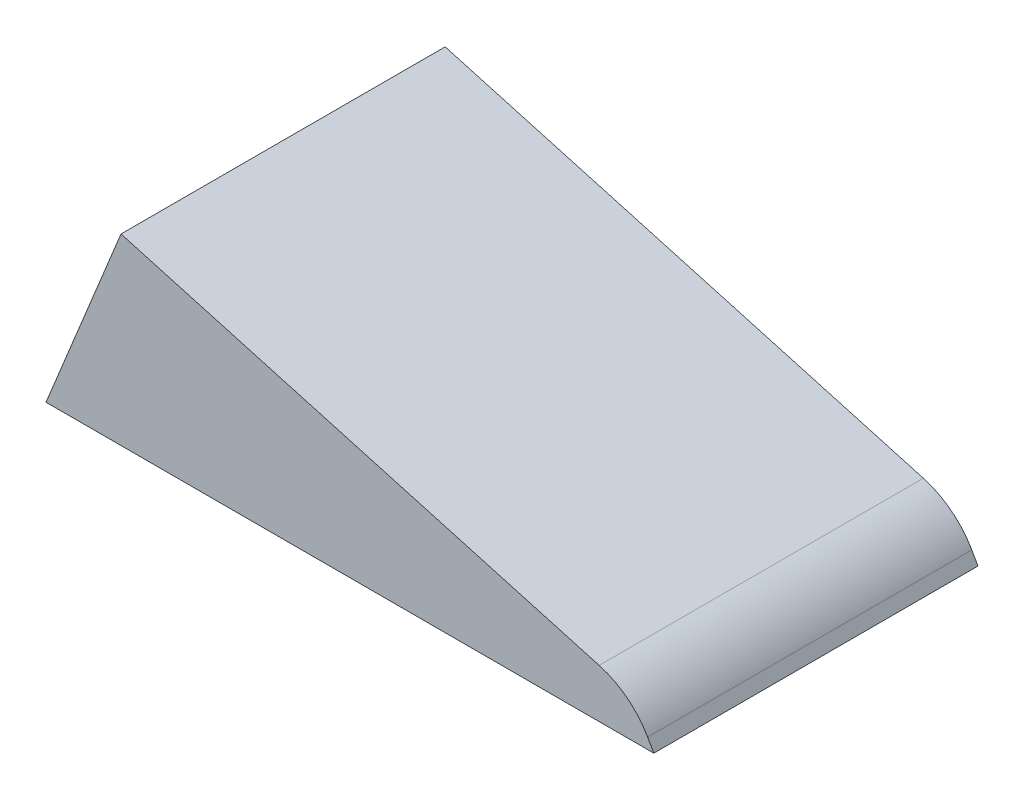
ISO-10303-21;
HEADER;
FILE_DESCRIPTION(('STEP AP214'),'2;1');
FILE_NAME('part.step','',(''),(''),'','','');
FILE_SCHEMA(('AUTOMOTIVE_DESIGN { 1 0 10303 214 1 1 1 1 }'));
ENDSEC;
DATA;
#1=APPLICATION_CONTEXT('core data for automotive mechanical design processes');
#2=APPLICATION_PROTOCOL_DEFINITION('international standard','automotive_design',2000,#1);
#3=PRODUCT_CONTEXT('',#1,'mechanical');
#4=PRODUCT('Part','Part','',(#3));
#5=PRODUCT_RELATED_PRODUCT_CATEGORY('part','',(#4));
#6=PRODUCT_DEFINITION_FORMATION('','',#4);
#7=PRODUCT_DEFINITION_CONTEXT('part definition',#1,'design');
#8=PRODUCT_DEFINITION('design','',#6,#7);
#9=PRODUCT_DEFINITION_SHAPE('','',#8);
#10=(LENGTH_UNIT() NAMED_UNIT(*) SI_UNIT(.MILLI.,.METRE.));
#11=(NAMED_UNIT(*) PLANE_ANGLE_UNIT() SI_UNIT($,.RADIAN.));
#12=(NAMED_UNIT(*) SI_UNIT($,.STERADIAN.) SOLID_ANGLE_UNIT());
#13=UNCERTAINTY_MEASURE_WITH_UNIT(LENGTH_MEASURE(1.E-05),#10,'distance_accuracy_value','');
#14=(GEOMETRIC_REPRESENTATION_CONTEXT(3) GLOBAL_UNCERTAINTY_ASSIGNED_CONTEXT((#13)) GLOBAL_UNIT_ASSIGNED_CONTEXT((#10,
#11,#12)) REPRESENTATION_CONTEXT('',''));
#15=CARTESIAN_POINT('',(0.,0.,0.));
#16=DIRECTION('',(0.,0.,1.));
#17=DIRECTION('',(1.,0.,0.));
#18=AXIS2_PLACEMENT_3D('',#15,#16,#17);
#19=CARTESIAN_POINT('',(293.18251347766,-54.6718210159724,203.2));
#20=DIRECTION('',(0.,1.,0.));
#21=DIRECTION('',(-1.,0.,0.));
#22=AXIS2_PLACEMENT_3D('',#19,#20,#21);
#23=PLANE('',#22);
#24=DIRECTION('',(1.,0.,0.));
#25=VECTOR('',#24,1.);
#26=CARTESIAN_POINT('',(293.18251347766,-54.6718210159724,0.));
#27=LINE('',#26,#25);
#28=CARTESIAN_POINT('',(-87.81748652234,-54.6718210159725,0.));
#29=VERTEX_POINT('',#28);
#30=CARTESIAN_POINT('',(293.18251347766,-54.6718210159724,0.));
#31=VERTEX_POINT('',#30);
#32=EDGE_CURVE('E97',#29,#31,#27,.T.);
#33=ORIENTED_EDGE('',*,*,#32,.T.);
#34=DIRECTION('',(0.,0.,-1.));
#35=VECTOR('',#34,1.);
#36=CARTESIAN_POINT('',(293.18251347766,-54.6718210159724,203.2));
#37=LINE('',#36,#35);
#38=CARTESIAN_POINT('',(293.18251347766,-54.6718210159724,203.2));
#39=VERTEX_POINT('',#38);
#40=EDGE_CURVE('E80',#39,#31,#37,.T.);
#41=ORIENTED_EDGE('',*,*,#40,.F.);
#42=DIRECTION('',(1.,0.,0.));
#43=VECTOR('',#42,1.);
#44=CARTESIAN_POINT('',(293.18251347766,-54.6718210159724,203.2));
#45=LINE('',#44,#43);
#46=CARTESIAN_POINT('',(-87.81748652234,-54.6718210159725,203.2));
#47=VERTEX_POINT('',#46);
#48=EDGE_CURVE('E85',#47,#39,#45,.T.);
#49=ORIENTED_EDGE('',*,*,#48,.F.);
#50=DIRECTION('',(0.,0.,-1.));
#51=VECTOR('',#50,1.);
#52=CARTESIAN_POINT('',(-87.81748652234,-54.6718210159725,203.2));
#53=LINE('',#52,#51);
#54=EDGE_CURVE('E104',#47,#29,#53,.T.);
#55=ORIENTED_EDGE('',*,*,#54,.T.);
#56=EDGE_LOOP('',(#33,#41,#49,#55));
#57=FACE_BOUND('',#56,.T.);
#58=ADVANCED_FACE('F33',(#57),#23,.F.);
#59=CARTESIAN_POINT('',(278.977822444077,-29.7727212354211,203.2));
#60=DIRECTION('',(-0.868594049851145,-0.49552434507619,0.));
#61=DIRECTION('',(0.49552434507619,-0.868594049851145,0.));
#62=AXIS2_PLACEMENT_3D('',#59,#60,#61);
#63=PLANE('',#62);
#64=DIRECTION('',(-0.49552434507619,0.868594049851145,0.));
#65=VECTOR('',#64,1.);
#66=CARTESIAN_POINT('',(278.977822444077,-29.7727212354211,0.));
#67=LINE('',#66,#65);
#68=CARTESIAN_POINT('',(289.298029598701,-47.8627921205553,0.));
#69=VERTEX_POINT('',#68);
#70=EDGE_CURVE('E112',#31,#69,#67,.T.);
#71=ORIENTED_EDGE('',*,*,#70,.T.);
#72=DIRECTION('',(0.,0.,-1.));
#73=VECTOR('',#72,1.);
#74=CARTESIAN_POINT('',(289.298029598701,-47.8627921205553,203.2));
#75=LINE('',#74,#73);
#76=CARTESIAN_POINT('',(289.298029598701,-47.8627921205553,203.2));
#77=VERTEX_POINT('',#76);
#78=EDGE_CURVE('E41',#69,#77,#75,.F.);
#79=ORIENTED_EDGE('',*,*,#78,.T.);
#80=DIRECTION('',(-0.49552434507619,0.868594049851145,0.));
#81=VECTOR('',#80,1.);
#82=CARTESIAN_POINT('',(278.977822444077,-29.7727212354211,203.2));
#83=LINE('',#82,#81);
#84=EDGE_CURVE('E76',#39,#77,#83,.T.);
#85=ORIENTED_EDGE('',*,*,#84,.F.);
#86=ORIENTED_EDGE('',*,*,#40,.T.);
#87=EDGE_LOOP('',(#71,#79,#85,#86));
#88=FACE_BOUND('',#87,.T.);
#89=ADVANCED_FACE('F78',(#88),#63,.F.);
#90=CARTESIAN_POINT('',(-40.8116602225022,60.1801663624286,203.2));
#91=DIRECTION('',(-0.270779318330784,-0.962641449743525,0.));
#92=DIRECTION('',(0.962641449743525,-0.270779318330784,0.));
#93=AXIS2_PLACEMENT_3D('',#90,#91,#92);
#94=PLANE('',#93);
#95=DIRECTION('',(-0.962641449743525,0.270779318330784,0.));
#96=VECTOR('',#95,1.);
#97=CARTESIAN_POINT('',(-40.8116602225022,60.1801663624286,203.2));
#98=LINE('',#97,#96);
#99=CARTESIAN_POINT('',(258.929041237467,-24.1332432034547,203.2));
#100=VERTEX_POINT('',#99);
#101=CARTESIAN_POINT('',(-40.8116602225022,60.1801663624286,203.2));
#102=VERTEX_POINT('',#101);
#103=EDGE_CURVE('E84',#100,#102,#98,.T.);
#104=ORIENTED_EDGE('',*,*,#103,.F.);
#105=DIRECTION('',(0.,0.,-1.));
#106=VECTOR('',#105,1.);
#107=CARTESIAN_POINT('',(258.929041237467,-24.1332432034547,203.2));
#108=LINE('',#107,#106);
#109=CARTESIAN_POINT('',(258.929041237467,-24.1332432034547,0.));
#110=VERTEX_POINT('',#109);
#111=EDGE_CURVE('E98',#100,#110,#108,.T.);
#112=ORIENTED_EDGE('',*,*,#111,.T.);
#113=DIRECTION('',(-0.962641449743525,0.270779318330784,0.));
#114=VECTOR('',#113,1.);
#115=CARTESIAN_POINT('',(-40.8116602225022,60.1801663624286,0.));
#116=LINE('',#115,#114);
#117=CARTESIAN_POINT('',(-40.8116602225022,60.1801663624286,0.));
#118=VERTEX_POINT('',#117);
#119=EDGE_CURVE('E110',#110,#118,#116,.T.);
#120=ORIENTED_EDGE('',*,*,#119,.T.);
#121=DIRECTION('',(0.,0.,-1.));
#122=VECTOR('',#121,1.);
#123=CARTESIAN_POINT('',(-40.8116602225022,60.1801663624286,203.2));
#124=LINE('',#123,#122);
#125=EDGE_CURVE('E99',#102,#118,#124,.T.);
#126=ORIENTED_EDGE('',*,*,#125,.F.);
#127=EDGE_LOOP('',(#104,#112,#120,#126));
#128=FACE_BOUND('',#127,.T.);
#129=ADVANCED_FACE('F120',(#128),#94,.F.);
#130=CARTESIAN_POINT('',(-87.81748652234,-54.6718210159725,203.2));
#131=DIRECTION('',(0.925487862299106,-0.378777265338129,0.));
#132=DIRECTION('',(0.378777265338129,0.925487862299106,0.));
#133=AXIS2_PLACEMENT_3D('',#130,#131,#132);
#134=PLANE('',#133);
#135=DIRECTION('',(-0.378777265338129,-0.925487862299106,0.));
#136=VECTOR('',#135,1.);
#137=CARTESIAN_POINT('',(-87.81748652234,-54.6718210159725,0.));
#138=LINE('',#137,#136);
#139=EDGE_CURVE('E94',#118,#29,#138,.T.);
#140=ORIENTED_EDGE('',*,*,#139,.T.);
#141=ORIENTED_EDGE('',*,*,#54,.F.);
#142=DIRECTION('',(-0.378777265338129,-0.925487862299106,0.));
#143=VECTOR('',#142,1.);
#144=CARTESIAN_POINT('',(-87.81748652234,-54.6718210159725,203.2));
#145=LINE('',#144,#143);
#146=EDGE_CURVE('E90',#102,#47,#145,.T.);
#147=ORIENTED_EDGE('',*,*,#146,.F.);
#148=ORIENTED_EDGE('',*,*,#125,.T.);
#149=EDGE_LOOP('',(#140,#141,#147,#148));
#150=FACE_BOUND('',#149,.T.);
#151=ADVANCED_FACE('F123',(#150),#134,.F.);
#152=CARTESIAN_POINT('',(0.,0.,203.2));
#153=DIRECTION('',(0.,0.,-1.));
#154=DIRECTION('',(-1.,0.,0.));
#155=AXIS2_PLACEMENT_3D('',#152,#153,#154);
#156=PLANE('',#155);
#157=ORIENTED_EDGE('',*,*,#84,.T.);
#158=CARTESIAN_POINT('',(245.173451866263,-73.0354288504258,203.2));
#159=DIRECTION('',(0.,0.,-1.));
#160=DIRECTION('',(-1.,0.,0.));
#161=AXIS2_PLACEMENT_3D('',#158,#159,#160);
#162=CIRCLE('',#161,50.8);
#163=EDGE_CURVE('E11',#77,#100,#162,.F.);
#164=ORIENTED_EDGE('',*,*,#163,.T.);
#165=ORIENTED_EDGE('',*,*,#103,.T.);
#166=ORIENTED_EDGE('',*,*,#146,.T.);
#167=ORIENTED_EDGE('',*,*,#48,.T.);
#168=EDGE_LOOP('',(#157,#164,#165,#166,#167));
#169=FACE_BOUND('',#168,.T.);
#170=ADVANCED_FACE('F88',(#169),#156,.F.);
#171=CARTESIAN_POINT('',(0.,0.,0.));
#172=DIRECTION('',(0.,0.,-1.));
#173=DIRECTION('',(-1.,0.,0.));
#174=AXIS2_PLACEMENT_3D('',#171,#172,#173);
#175=PLANE('',#174);
#176=ORIENTED_EDGE('',*,*,#119,.F.);
#177=CARTESIAN_POINT('',(245.173451866263,-73.0354288504258,0.));
#178=DIRECTION('',(0.,0.,-1.));
#179=DIRECTION('',(-1.,0.,0.));
#180=AXIS2_PLACEMENT_3D('',#177,#178,#179);
#181=CIRCLE('',#180,50.8);
#182=EDGE_CURVE('E55',#110,#69,#181,.T.);
#183=ORIENTED_EDGE('',*,*,#182,.T.);
#184=ORIENTED_EDGE('',*,*,#70,.F.);
#185=ORIENTED_EDGE('',*,*,#32,.F.);
#186=ORIENTED_EDGE('',*,*,#139,.F.);
#187=EDGE_LOOP('',(#176,#183,#184,#185,#186));
#188=FACE_BOUND('',#187,.T.);
#189=ADVANCED_FACE('F124',(#188),#175,.T.);
#190=CARTESIAN_POINT('',(245.173451866263,-73.0354288504258,203.2));
#191=DIRECTION('',(0.,0.,-1.));
#192=DIRECTION('',(-1.,0.,0.));
#193=AXIS2_PLACEMENT_3D('',#190,#191,#192);
#194=CYLINDRICAL_SURFACE('',#193,50.8);
#195=ORIENTED_EDGE('',*,*,#163,.F.);
#196=ORIENTED_EDGE('',*,*,#78,.F.);
#197=ORIENTED_EDGE('',*,*,#182,.F.);
#198=ORIENTED_EDGE('',*,*,#111,.F.);
#199=EDGE_LOOP('',(#195,#196,#197,#198));
#200=FACE_BOUND('',#199,.T.);
#201=ADVANCED_FACE('F35',(#200),#194,.T.);
#202=CLOSED_SHELL('',(#58,#89,#129,#151,#170,#189,#201));
#203=MANIFOLD_SOLID_BREP('B2',#202);
#204=ADVANCED_BREP_SHAPE_REPRESENTATION('',(#18,#203),#14);
#205=SHAPE_DEFINITION_REPRESENTATION(#9,#204);
ENDSEC;
END-ISO-10303-21;
